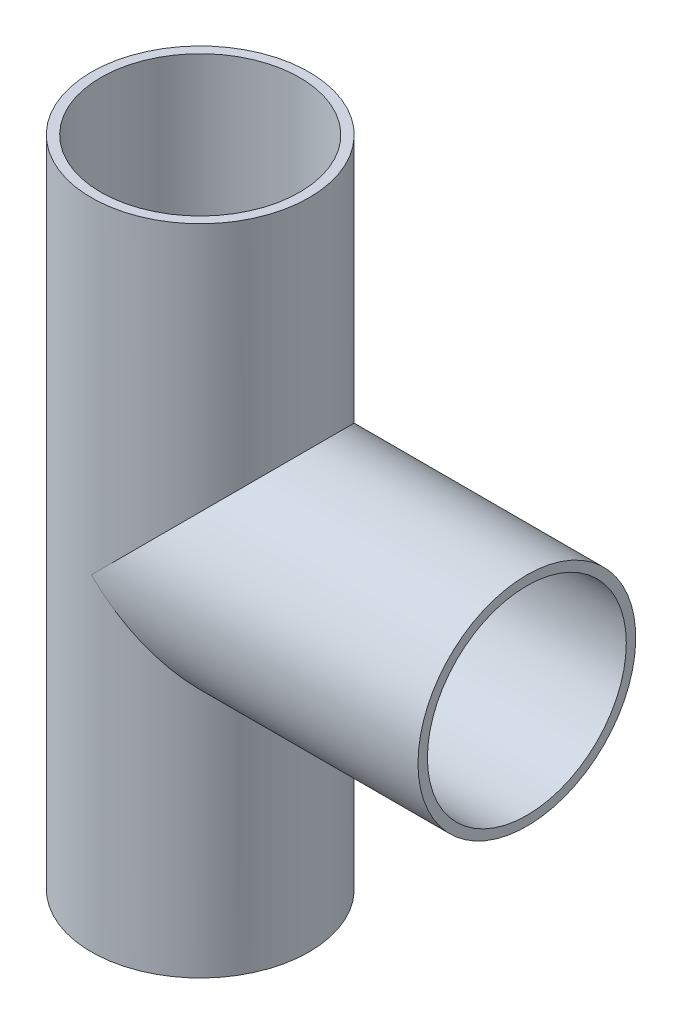
ISO-10303-21;
HEADER;
FILE_DESCRIPTION(('STEP AP214'),'2;1');
FILE_NAME('part.step','',(''),(''),'','','');
FILE_SCHEMA(('AUTOMOTIVE_DESIGN { 1 0 10303 214 1 1 1 1 }'));
ENDSEC;
DATA;
#1=APPLICATION_CONTEXT('core data for automotive mechanical design processes');
#2=APPLICATION_PROTOCOL_DEFINITION('international standard','automotive_design',2000,#1);
#3=PRODUCT_CONTEXT('',#1,'mechanical');
#4=PRODUCT('Part','Part','',(#3));
#5=PRODUCT_RELATED_PRODUCT_CATEGORY('part','',(#4));
#6=PRODUCT_DEFINITION_FORMATION('','',#4);
#7=PRODUCT_DEFINITION_CONTEXT('part definition',#1,'design');
#8=PRODUCT_DEFINITION('design','',#6,#7);
#9=PRODUCT_DEFINITION_SHAPE('','',#8);
#10=(LENGTH_UNIT() NAMED_UNIT(*) SI_UNIT(.MILLI.,.METRE.));
#11=(NAMED_UNIT(*) PLANE_ANGLE_UNIT() SI_UNIT($,.RADIAN.));
#12=(NAMED_UNIT(*) SI_UNIT($,.STERADIAN.) SOLID_ANGLE_UNIT());
#13=UNCERTAINTY_MEASURE_WITH_UNIT(LENGTH_MEASURE(1.E-05),#10,'distance_accuracy_value','');
#14=(GEOMETRIC_REPRESENTATION_CONTEXT(3) GLOBAL_UNCERTAINTY_ASSIGNED_CONTEXT((#13)) GLOBAL_UNIT_ASSIGNED_CONTEXT((#10,
#11,#12)) REPRESENTATION_CONTEXT('',''));
#15=CARTESIAN_POINT('',(0.,0.,0.));
#16=DIRECTION('',(0.,0.,1.));
#17=DIRECTION('',(1.,0.,0.));
#18=AXIS2_PLACEMENT_3D('',#15,#16,#17);
#19=CARTESIAN_POINT('',(0.,-57.15,0.));
#20=DIRECTION('',(0.,1.,0.));
#21=DIRECTION('',(1.,0.,0.));
#22=AXIS2_PLACEMENT_3D('',#19,#20,#21);
#23=PLANE('',#22);
#24=CARTESIAN_POINT('',(0.,-57.15,0.));
#25=DIRECTION('',(0.,1.,0.));
#26=DIRECTION('',(0.,0.,1.));
#27=AXIS2_PLACEMENT_3D('',#24,#25,#26);
#28=CIRCLE('',#27,17.399);
#29=CARTESIAN_POINT('',(0.,-57.15,17.399));
#30=VERTEX_POINT('',#29);
#31=EDGE_CURVE('E24',#30,#30,#28,.T.);
#32=ORIENTED_EDGE('',*,*,#31,.T.);
#33=EDGE_LOOP('',(#32));
#34=FACE_BOUND('',#33,.T.);
#35=CARTESIAN_POINT('',(0.,-57.15,0.));
#36=DIRECTION('',(0.,1.,0.));
#37=DIRECTION('',(1.,0.,0.));
#38=AXIS2_PLACEMENT_3D('',#35,#36,#37);
#39=CIRCLE('',#38,19.05);
#40=CARTESIAN_POINT('',(19.05,-57.15,0.));
#41=VERTEX_POINT('',#40);
#42=EDGE_CURVE('E91',#41,#41,#39,.T.);
#43=ORIENTED_EDGE('',*,*,#42,.F.);
#44=EDGE_LOOP('',(#43));
#45=FACE_BOUND('',#44,.T.);
#46=ADVANCED_FACE('F16',(#34,#45),#23,.F.);
#47=CARTESIAN_POINT('',(0.,57.15,0.));
#48=DIRECTION('',(0.,1.,0.));
#49=DIRECTION('',(1.,0.,0.));
#50=AXIS2_PLACEMENT_3D('',#47,#48,#49);
#51=PLANE('',#50);
#52=CARTESIAN_POINT('',(0.,57.15,0.));
#53=DIRECTION('',(0.,1.,0.));
#54=DIRECTION('',(0.,0.,1.));
#55=AXIS2_PLACEMENT_3D('',#52,#53,#54);
#56=CIRCLE('',#55,17.399);
#57=CARTESIAN_POINT('',(0.,57.15,17.399));
#58=VERTEX_POINT('',#57);
#59=EDGE_CURVE('E69',#58,#58,#56,.T.);
#60=ORIENTED_EDGE('',*,*,#59,.F.);
#61=EDGE_LOOP('',(#60));
#62=FACE_BOUND('',#61,.T.);
#63=CARTESIAN_POINT('',(0.,57.15,0.));
#64=DIRECTION('',(0.,1.,0.));
#65=DIRECTION('',(1.,0.,0.));
#66=AXIS2_PLACEMENT_3D('',#63,#64,#65);
#67=CIRCLE('',#66,19.05);
#68=CARTESIAN_POINT('',(19.05,57.15,0.));
#69=VERTEX_POINT('',#68);
#70=EDGE_CURVE('E92',#69,#69,#67,.T.);
#71=ORIENTED_EDGE('',*,*,#70,.T.);
#72=EDGE_LOOP('',(#71));
#73=FACE_BOUND('',#72,.T.);
#74=ADVANCED_FACE('F108',(#62,#73),#51,.T.);
#75=CARTESIAN_POINT('',(57.15,0.,0.));
#76=DIRECTION('',(-1.,0.,0.));
#77=DIRECTION('',(0.,0.,1.));
#78=AXIS2_PLACEMENT_3D('',#75,#76,#77);
#79=PLANE('',#78);
#80=CARTESIAN_POINT('',(57.15,0.,0.));
#81=DIRECTION('',(-1.,0.,0.));
#82=DIRECTION('',(0.,-1.,0.));
#83=AXIS2_PLACEMENT_3D('',#80,#81,#82);
#84=CIRCLE('',#83,17.399);
#85=CARTESIAN_POINT('',(57.15,-17.399,0.));
#86=VERTEX_POINT('',#85);
#87=EDGE_CURVE('E64',#86,#86,#84,.T.);
#88=ORIENTED_EDGE('',*,*,#87,.T.);
#89=EDGE_LOOP('',(#88));
#90=FACE_BOUND('',#89,.T.);
#91=CARTESIAN_POINT('',(57.15,0.,0.));
#92=DIRECTION('',(-1.,0.,0.));
#93=DIRECTION('',(0.,1.,0.));
#94=AXIS2_PLACEMENT_3D('',#91,#92,#93);
#95=CIRCLE('',#94,19.05);
#96=CARTESIAN_POINT('',(57.15,19.05,0.));
#97=VERTEX_POINT('',#96);
#98=EDGE_CURVE('E11',#97,#97,#95,.T.);
#99=ORIENTED_EDGE('',*,*,#98,.F.);
#100=EDGE_LOOP('',(#99));
#101=FACE_BOUND('',#100,.T.);
#102=ADVANCED_FACE('F65',(#90,#101),#79,.F.);
#103=CARTESIAN_POINT('',(57.15,0.,0.));
#104=DIRECTION('',(1.,0.,0.));
#105=DIRECTION('',(0.,0.,1.));
#106=AXIS2_PLACEMENT_3D('',#103,#104,#105);
#107=CYLINDRICAL_SURFACE('',#106,19.05);
#108=ORIENTED_EDGE('',*,*,#98,.T.);
#109=EDGE_LOOP('',(#108));
#110=FACE_BOUND('',#109,.T.);
#111=CARTESIAN_POINT('',(0.,0.,0.));
#112=DIRECTION('',(0.707106781186548,0.707106781186548,0.));
#113=DIRECTION('',(-0.707106781186548,0.707106781186548,0.));
#114=AXIS2_PLACEMENT_3D('',#111,#112,#113);
#115=ELLIPSE('',#114,26.9407683632075,19.05);
#116=CARTESIAN_POINT('',(0.,0.,19.05));
#117=VERTEX_POINT('',#116);
#118=CARTESIAN_POINT('',(0.,0.,-19.05));
#119=VERTEX_POINT('',#118);
#120=EDGE_CURVE('E81',#117,#119,#115,.T.);
#121=ORIENTED_EDGE('',*,*,#120,.T.);
#122=CARTESIAN_POINT('',(0.,0.,0.));
#123=DIRECTION('',(0.707106781186548,-0.707106781186548,0.));
#124=DIRECTION('',(0.707106781186548,0.707106781186548,0.));
#125=AXIS2_PLACEMENT_3D('',#122,#123,#124);
#126=ELLIPSE('',#125,26.9407683632075,19.05);
#127=EDGE_CURVE('E87',#119,#117,#126,.T.);
#128=ORIENTED_EDGE('',*,*,#127,.T.);
#129=EDGE_LOOP('',(#121,#128));
#130=FACE_BOUND('',#129,.T.);
#131=ADVANCED_FACE('F120',(#110,#130),#107,.T.);
#132=CARTESIAN_POINT('',(0.,-57.15,0.));
#133=DIRECTION('',(0.,-1.,0.));
#134=DIRECTION('',(0.,0.,1.));
#135=AXIS2_PLACEMENT_3D('',#132,#133,#134);
#136=CYLINDRICAL_SURFACE('',#135,17.399);
#137=CARTESIAN_POINT('',(0.,0.,0.));
#138=DIRECTION('',(0.707106781186548,-0.707106781186548,0.));
#139=DIRECTION('',(0.707106781186548,0.707106781186548,0.));
#140=AXIS2_PLACEMENT_3D('',#137,#138,#139);
#141=ELLIPSE('',#140,24.6059017717295,17.399);
#142=CARTESIAN_POINT('',(0.,0.,-17.399));
#143=VERTEX_POINT('',#142);
#144=CARTESIAN_POINT('',(0.,0.,17.399));
#145=VERTEX_POINT('',#144);
#146=EDGE_CURVE('E70',#143,#145,#141,.T.);
#147=ORIENTED_EDGE('',*,*,#146,.T.);
#148=CARTESIAN_POINT('',(0.,0.,0.));
#149=DIRECTION('',(0.707106781186548,0.707106781186548,0.));
#150=DIRECTION('',(-0.707106781186548,0.707106781186548,0.));
#151=AXIS2_PLACEMENT_3D('',#148,#149,#150);
#152=ELLIPSE('',#151,24.6059017717295,17.399);
#153=EDGE_CURVE('E75',#145,#143,#152,.T.);
#154=ORIENTED_EDGE('',*,*,#153,.T.);
#155=EDGE_LOOP('',(#147,#154));
#156=FACE_BOUND('',#155,.T.);
#157=ORIENTED_EDGE('',*,*,#31,.F.);
#158=EDGE_LOOP('',(#157));
#159=FACE_BOUND('',#158,.T.);
#160=ORIENTED_EDGE('',*,*,#59,.T.);
#161=EDGE_LOOP('',(#160));
#162=FACE_BOUND('',#161,.T.);
#163=ADVANCED_FACE('F130',(#156,#159,#162),#136,.F.);
#164=CARTESIAN_POINT('',(57.15,0.,0.));
#165=DIRECTION('',(1.,0.,0.));
#166=DIRECTION('',(0.,0.,1.));
#167=AXIS2_PLACEMENT_3D('',#164,#165,#166);
#168=CYLINDRICAL_SURFACE('',#167,17.399);
#169=ORIENTED_EDGE('',*,*,#87,.F.);
#170=EDGE_LOOP('',(#169));
#171=FACE_BOUND('',#170,.T.);
#172=ORIENTED_EDGE('',*,*,#153,.F.);
#173=ORIENTED_EDGE('',*,*,#146,.F.);
#174=EDGE_LOOP('',(#172,#173));
#175=FACE_BOUND('',#174,.T.);
#176=ADVANCED_FACE('F126',(#171,#175),#168,.F.);
#177=CARTESIAN_POINT('',(0.,-57.15,0.));
#178=DIRECTION('',(0.,-1.,0.));
#179=DIRECTION('',(0.,0.,1.));
#180=AXIS2_PLACEMENT_3D('',#177,#178,#179);
#181=CYLINDRICAL_SURFACE('',#180,19.05);
#182=ORIENTED_EDGE('',*,*,#127,.F.);
#183=ORIENTED_EDGE('',*,*,#120,.F.);
#184=EDGE_LOOP('',(#182,#183));
#185=FACE_BOUND('',#184,.T.);
#186=ORIENTED_EDGE('',*,*,#42,.T.);
#187=EDGE_LOOP('',(#186));
#188=FACE_BOUND('',#187,.T.);
#189=ORIENTED_EDGE('',*,*,#70,.F.);
#190=EDGE_LOOP('',(#189));
#191=FACE_BOUND('',#190,.T.);
#192=ADVANCED_FACE('F102',(#185,#188,#191),#181,.T.);
#193=CLOSED_SHELL('',(#46,#74,#102,#131,#163,#176,#192));
#194=MANIFOLD_SOLID_BREP('B1',#193);
#195=ADVANCED_BREP_SHAPE_REPRESENTATION('',(#18,#194),#14);
#196=SHAPE_DEFINITION_REPRESENTATION(#9,#195);
ENDSEC;
END-ISO-10303-21;
